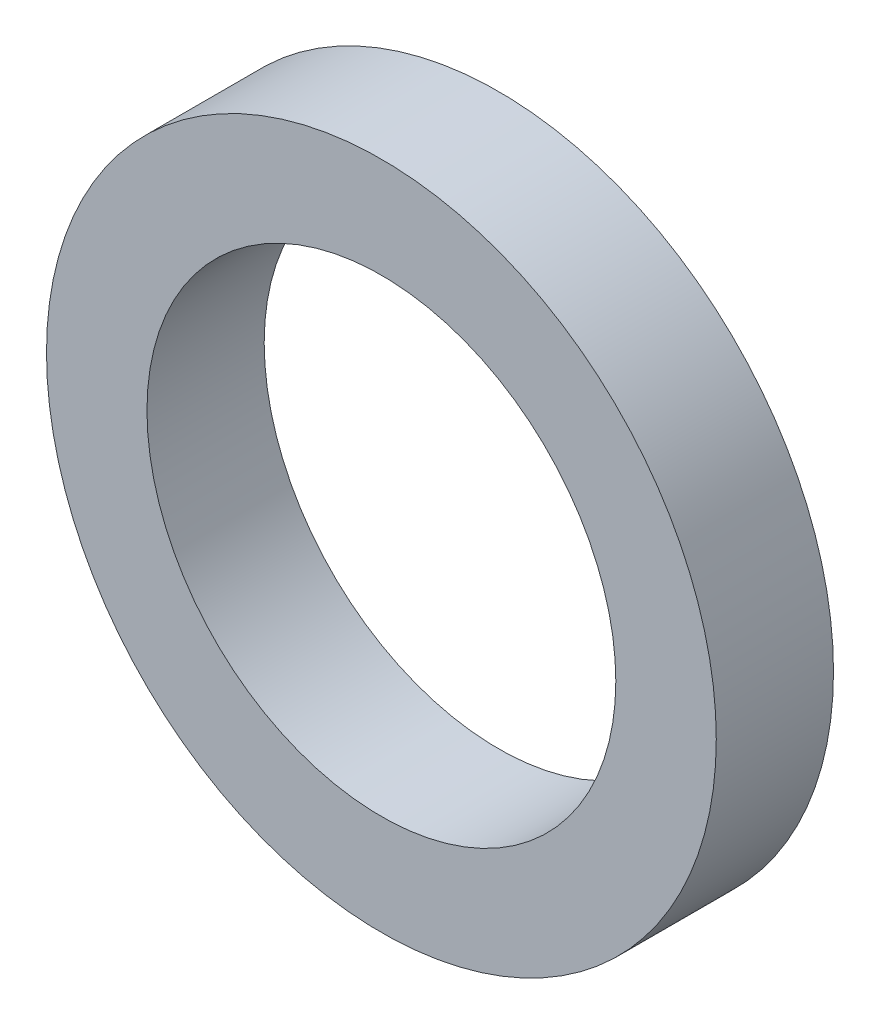
ISO-10303-21;
HEADER;
FILE_DESCRIPTION(('STEP AP214'),'2;1');
FILE_NAME('part.step','',(''),(''),'','','');
FILE_SCHEMA(('AUTOMOTIVE_DESIGN { 1 0 10303 214 1 1 1 1 }'));
ENDSEC;
DATA;
#1=APPLICATION_CONTEXT('core data for automotive mechanical design processes');
#2=APPLICATION_PROTOCOL_DEFINITION('international standard','automotive_design',2000,#1);
#3=PRODUCT_CONTEXT('',#1,'mechanical');
#4=PRODUCT('Part','Part','',(#3));
#5=PRODUCT_RELATED_PRODUCT_CATEGORY('part','',(#4));
#6=PRODUCT_DEFINITION_FORMATION('','',#4);
#7=PRODUCT_DEFINITION_CONTEXT('part definition',#1,'design');
#8=PRODUCT_DEFINITION('design','',#6,#7);
#9=PRODUCT_DEFINITION_SHAPE('','',#8);
#10=(LENGTH_UNIT() NAMED_UNIT(*) SI_UNIT(.MILLI.,.METRE.));
#11=(NAMED_UNIT(*) PLANE_ANGLE_UNIT() SI_UNIT($,.RADIAN.));
#12=(NAMED_UNIT(*) SI_UNIT($,.STERADIAN.) SOLID_ANGLE_UNIT());
#13=UNCERTAINTY_MEASURE_WITH_UNIT(LENGTH_MEASURE(1.E-05),#10,'distance_accuracy_value','');
#14=(GEOMETRIC_REPRESENTATION_CONTEXT(3) GLOBAL_UNCERTAINTY_ASSIGNED_CONTEXT((#13)) GLOBAL_UNIT_ASSIGNED_CONTEXT((#10,
#11,#12)) REPRESENTATION_CONTEXT('',''));
#15=CARTESIAN_POINT('',(0.,0.,0.));
#16=DIRECTION('',(0.,0.,1.));
#17=DIRECTION('',(1.,0.,0.));
#18=AXIS2_PLACEMENT_3D('',#15,#16,#17);
#19=CARTESIAN_POINT('',(0.,0.,7.));
#20=DIRECTION('',(0.,0.,1.));
#21=DIRECTION('',(1.,0.,0.));
#22=AXIS2_PLACEMENT_3D('',#19,#20,#21);
#23=PLANE('',#22);
#24=CARTESIAN_POINT('',(0.,0.,7.));
#25=DIRECTION('',(0.,0.,1.));
#26=DIRECTION('',(1.,0.,0.));
#27=AXIS2_PLACEMENT_3D('',#24,#25,#26);
#28=CIRCLE('',#27,20.);
#29=CARTESIAN_POINT('',(20.,0.,7.));
#30=VERTEX_POINT('',#29);
#31=EDGE_CURVE('E10',#30,#30,#28,.T.);
#32=ORIENTED_EDGE('',*,*,#31,.T.);
#33=EDGE_LOOP('',(#32));
#34=FACE_BOUND('',#33,.T.);
#35=CARTESIAN_POINT('',(0.,0.,7.));
#36=DIRECTION('',(0.,0.,1.));
#37=DIRECTION('',(1.,0.,0.));
#38=AXIS2_PLACEMENT_3D('',#35,#36,#37);
#39=CIRCLE('',#38,14.);
#40=CARTESIAN_POINT('',(14.,0.,7.));
#41=VERTEX_POINT('',#40);
#42=EDGE_CURVE('E45',#41,#41,#39,.T.);
#43=ORIENTED_EDGE('',*,*,#42,.F.);
#44=EDGE_LOOP('',(#43));
#45=FACE_BOUND('',#44,.T.);
#46=ADVANCED_FACE('F34',(#34,#45),#23,.T.);
#47=CARTESIAN_POINT('',(0.,0.,0.));
#48=DIRECTION('',(0.,0.,1.));
#49=DIRECTION('',(1.,0.,0.));
#50=AXIS2_PLACEMENT_3D('',#47,#48,#49);
#51=PLANE('',#50);
#52=CARTESIAN_POINT('',(0.,0.,0.));
#53=DIRECTION('',(0.,0.,1.));
#54=DIRECTION('',(1.,0.,0.));
#55=AXIS2_PLACEMENT_3D('',#52,#53,#54);
#56=CIRCLE('',#55,20.);
#57=CARTESIAN_POINT('',(20.,0.,0.));
#58=VERTEX_POINT('',#57);
#59=EDGE_CURVE('E38',#58,#58,#56,.T.);
#60=ORIENTED_EDGE('',*,*,#59,.F.);
#61=EDGE_LOOP('',(#60));
#62=FACE_BOUND('',#61,.T.);
#63=CARTESIAN_POINT('',(0.,0.,0.));
#64=DIRECTION('',(0.,0.,1.));
#65=DIRECTION('',(1.,0.,0.));
#66=AXIS2_PLACEMENT_3D('',#63,#64,#65);
#67=CIRCLE('',#66,14.);
#68=CARTESIAN_POINT('',(14.,0.,0.));
#69=VERTEX_POINT('',#68);
#70=EDGE_CURVE('E47',#69,#69,#67,.T.);
#71=ORIENTED_EDGE('',*,*,#70,.T.);
#72=EDGE_LOOP('',(#71));
#73=FACE_BOUND('',#72,.T.);
#74=ADVANCED_FACE('F57',(#62,#73),#51,.F.);
#75=CARTESIAN_POINT('',(0.,0.,7.));
#76=DIRECTION('',(0.,0.,-1.));
#77=DIRECTION('',(-1.,0.,0.));
#78=AXIS2_PLACEMENT_3D('',#75,#76,#77);
#79=CYLINDRICAL_SURFACE('',#78,20.);
#80=ORIENTED_EDGE('',*,*,#31,.F.);
#81=EDGE_LOOP('',(#80));
#82=FACE_BOUND('',#81,.T.);
#83=ORIENTED_EDGE('',*,*,#59,.T.);
#84=EDGE_LOOP('',(#83));
#85=FACE_BOUND('',#84,.T.);
#86=ADVANCED_FACE('F36',(#82,#85),#79,.T.);
#87=CARTESIAN_POINT('',(0.,0.,7.));
#88=DIRECTION('',(0.,0.,-1.));
#89=DIRECTION('',(-1.,0.,0.));
#90=AXIS2_PLACEMENT_3D('',#87,#88,#89);
#91=CYLINDRICAL_SURFACE('',#90,14.);
#92=ORIENTED_EDGE('',*,*,#42,.T.);
#93=EDGE_LOOP('',(#92));
#94=FACE_BOUND('',#93,.T.);
#95=ORIENTED_EDGE('',*,*,#70,.F.);
#96=EDGE_LOOP('',(#95));
#97=FACE_BOUND('',#96,.T.);
#98=ADVANCED_FACE('F53',(#94,#97),#91,.F.);
#99=CLOSED_SHELL('',(#46,#74,#86,#98));
#100=MANIFOLD_SOLID_BREP('B2',#99);
#101=ADVANCED_BREP_SHAPE_REPRESENTATION('',(#18,#100),#14);
#102=SHAPE_DEFINITION_REPRESENTATION(#9,#101);
ENDSEC;
END-ISO-10303-21;
